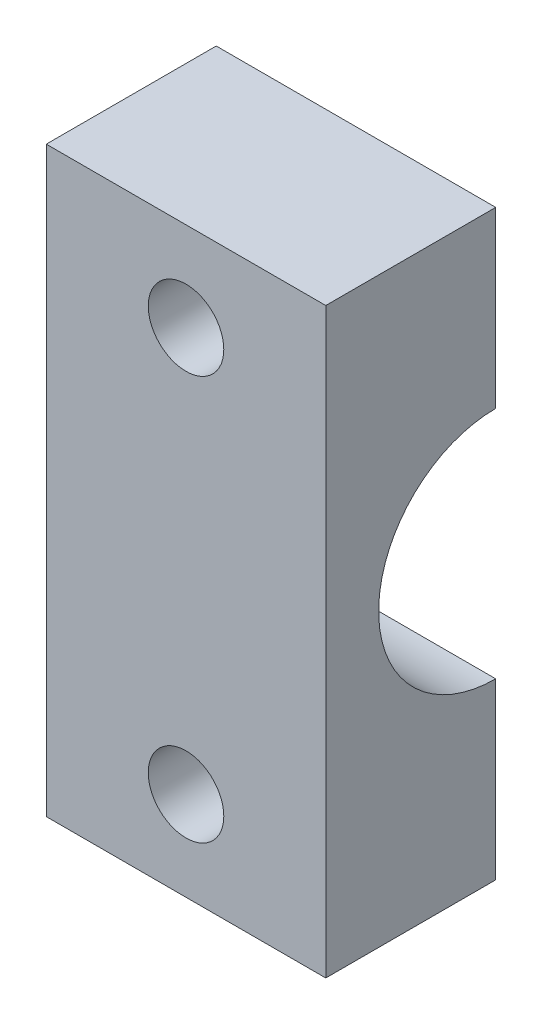
ISO-10303-21;
HEADER;
FILE_DESCRIPTION(('STEP AP214'),'2;1');
FILE_NAME('part.step','',(''),(''),'','','');
FILE_SCHEMA(('AUTOMOTIVE_DESIGN { 1 0 10303 214 1 1 1 1 }'));
ENDSEC;
DATA;
#1=APPLICATION_CONTEXT('core data for automotive mechanical design processes');
#2=APPLICATION_PROTOCOL_DEFINITION('international standard','automotive_design',2000,#1);
#3=PRODUCT_CONTEXT('',#1,'mechanical');
#4=PRODUCT('Part','Part','',(#3));
#5=PRODUCT_RELATED_PRODUCT_CATEGORY('part','',(#4));
#6=PRODUCT_DEFINITION_FORMATION('','',#4);
#7=PRODUCT_DEFINITION_CONTEXT('part definition',#1,'design');
#8=PRODUCT_DEFINITION('design','',#6,#7);
#9=PRODUCT_DEFINITION_SHAPE('','',#8);
#10=(LENGTH_UNIT() NAMED_UNIT(*) SI_UNIT(.MILLI.,.METRE.));
#11=(NAMED_UNIT(*) PLANE_ANGLE_UNIT() SI_UNIT($,.RADIAN.));
#12=(NAMED_UNIT(*) SI_UNIT($,.STERADIAN.) SOLID_ANGLE_UNIT());
#13=UNCERTAINTY_MEASURE_WITH_UNIT(LENGTH_MEASURE(1.E-05),#10,'distance_accuracy_value','');
#14=(GEOMETRIC_REPRESENTATION_CONTEXT(3) GLOBAL_UNCERTAINTY_ASSIGNED_CONTEXT((#13)) GLOBAL_UNIT_ASSIGNED_CONTEXT((#10,
#11,#12)) REPRESENTATION_CONTEXT('',''));
#15=CARTESIAN_POINT('',(0.,0.,0.));
#16=DIRECTION('',(0.,0.,1.));
#17=DIRECTION('',(1.,0.,0.));
#18=AXIS2_PLACEMENT_3D('',#15,#16,#17);
#19=CARTESIAN_POINT('',(14.8,0.,0.));
#20=DIRECTION('',(-1.,0.,0.));
#21=DIRECTION('',(0.,0.,1.));
#22=AXIS2_PLACEMENT_3D('',#19,#20,#21);
#23=PLANE('',#22);
#24=DIRECTION('',(0.,1.,0.));
#25=VECTOR('',#24,1.);
#26=CARTESIAN_POINT('',(14.8,-33.3,74.579));
#27=LINE('',#26,#25);
#28=CARTESIAN_POINT('',(14.8,-33.3,74.579));
#29=VERTEX_POINT('',#28);
#30=CARTESIAN_POINT('',(14.8,-24.08,74.579));
#31=VERTEX_POINT('',#30);
#32=EDGE_CURVE('E129',#29,#31,#27,.T.);
#33=ORIENTED_EDGE('',*,*,#32,.T.);
#34=DIRECTION('',(0.,0.,1.));
#35=VECTOR('',#34,1.);
#36=CARTESIAN_POINT('',(14.8,-24.08,74.579));
#37=LINE('',#36,#35);
#38=CARTESIAN_POINT('',(14.8,-24.08,83.579));
#39=VERTEX_POINT('',#38);
#40=EDGE_CURVE('E50',#31,#39,#37,.T.);
#41=ORIENTED_EDGE('',*,*,#40,.T.);
#42=DIRECTION('',(0.,-1.,0.));
#43=VECTOR('',#42,1.);
#44=CARTESIAN_POINT('',(14.8,-39.5,83.579));
#45=LINE('',#44,#43);
#46=CARTESIAN_POINT('',(14.8,-54.92,83.579));
#47=VERTEX_POINT('',#46);
#48=EDGE_CURVE('E81',#39,#47,#45,.T.);
#49=ORIENTED_EDGE('',*,*,#48,.T.);
#50=DIRECTION('',(0.,0.,-1.));
#51=VECTOR('',#50,1.);
#52=CARTESIAN_POINT('',(14.8,-54.92,83.579));
#53=LINE('',#52,#51);
#54=CARTESIAN_POINT('',(14.8,-54.92,74.579));
#55=VERTEX_POINT('',#54);
#56=EDGE_CURVE('E120',#47,#55,#53,.T.);
#57=ORIENTED_EDGE('',*,*,#56,.T.);
#58=DIRECTION('',(0.,1.,0.));
#59=VECTOR('',#58,1.);
#60=CARTESIAN_POINT('',(14.8,-54.92,74.579));
#61=LINE('',#60,#59);
#62=CARTESIAN_POINT('',(14.8,-45.7,74.579));
#63=VERTEX_POINT('',#62);
#64=EDGE_CURVE('E122',#55,#63,#61,.T.);
#65=ORIENTED_EDGE('',*,*,#64,.T.);
#66=CARTESIAN_POINT('',(14.8,-39.5,74.579));
#67=DIRECTION('',(-1.,0.,0.));
#68=DIRECTION('',(0.,0.,1.));
#69=AXIS2_PLACEMENT_3D('',#66,#67,#68);
#70=CIRCLE('',#69,6.2);
#71=EDGE_CURVE('E126',#63,#29,#70,.T.);
#72=ORIENTED_EDGE('',*,*,#71,.T.);
#73=EDGE_LOOP('',(#33,#41,#49,#57,#65,#72));
#74=FACE_BOUND('',#73,.T.);
#75=ADVANCED_FACE('F36',(#74),#23,.F.);
#76=CARTESIAN_POINT('',(0.,0.,0.));
#77=DIRECTION('',(-1.,0.,0.));
#78=DIRECTION('',(0.,0.,1.));
#79=AXIS2_PLACEMENT_3D('',#76,#77,#78);
#80=PLANE('',#79);
#81=DIRECTION('',(0.,0.,1.));
#82=VECTOR('',#81,1.);
#83=CARTESIAN_POINT('',(0.,-24.08,74.579));
#84=LINE('',#83,#82);
#85=CARTESIAN_POINT('',(0.,-24.08,74.579));
#86=VERTEX_POINT('',#85);
#87=CARTESIAN_POINT('',(0.,-24.08,83.579));
#88=VERTEX_POINT('',#87);
#89=EDGE_CURVE('E98',#86,#88,#84,.T.);
#90=ORIENTED_EDGE('',*,*,#89,.F.);
#91=DIRECTION('',(0.,1.,0.));
#92=VECTOR('',#91,1.);
#93=CARTESIAN_POINT('',(0.,-33.3,74.579));
#94=LINE('',#93,#92);
#95=CARTESIAN_POINT('',(0.,-33.3,74.579));
#96=VERTEX_POINT('',#95);
#97=EDGE_CURVE('E106',#96,#86,#94,.T.);
#98=ORIENTED_EDGE('',*,*,#97,.F.);
#99=CARTESIAN_POINT('',(0.,-39.5,74.579));
#100=DIRECTION('',(-1.,0.,0.));
#101=DIRECTION('',(0.,0.,1.));
#102=AXIS2_PLACEMENT_3D('',#99,#100,#101);
#103=CIRCLE('',#102,6.2);
#104=CARTESIAN_POINT('',(0.,-45.7,74.579));
#105=VERTEX_POINT('',#104);
#106=EDGE_CURVE('E113',#105,#96,#103,.T.);
#107=ORIENTED_EDGE('',*,*,#106,.F.);
#108=DIRECTION('',(0.,1.,0.));
#109=VECTOR('',#108,1.);
#110=CARTESIAN_POINT('',(0.,-54.92,74.579));
#111=LINE('',#110,#109);
#112=CARTESIAN_POINT('',(0.,-54.92,74.579));
#113=VERTEX_POINT('',#112);
#114=EDGE_CURVE('E116',#113,#105,#111,.T.);
#115=ORIENTED_EDGE('',*,*,#114,.F.);
#116=DIRECTION('',(0.,0.,-1.));
#117=VECTOR('',#116,1.);
#118=CARTESIAN_POINT('',(0.,-54.92,83.579));
#119=LINE('',#118,#117);
#120=CARTESIAN_POINT('',(0.,-54.92,83.579));
#121=VERTEX_POINT('',#120);
#122=EDGE_CURVE('E132',#121,#113,#119,.T.);
#123=ORIENTED_EDGE('',*,*,#122,.F.);
#124=DIRECTION('',(0.,-1.,0.));
#125=VECTOR('',#124,1.);
#126=CARTESIAN_POINT('',(0.,-4.5,83.579));
#127=LINE('',#126,#125);
#128=EDGE_CURVE('E59',#88,#121,#127,.T.);
#129=ORIENTED_EDGE('',*,*,#128,.F.);
#130=EDGE_LOOP('',(#90,#98,#107,#115,#123,#129));
#131=FACE_BOUND('',#130,.T.);
#132=ADVANCED_FACE('F38',(#131),#80,.T.);
#133=CARTESIAN_POINT('',(0.,-54.92,83.579));
#134=DIRECTION('',(0.,-1.,0.));
#135=DIRECTION('',(0.,0.,-1.));
#136=AXIS2_PLACEMENT_3D('',#133,#134,#135);
#137=PLANE('',#136);
#138=ORIENTED_EDGE('',*,*,#56,.F.);
#139=DIRECTION('',(1.,0.,0.));
#140=VECTOR('',#139,1.);
#141=CARTESIAN_POINT('',(0.,-54.92,83.579));
#142=LINE('',#141,#140);
#143=EDGE_CURVE('E44',#121,#47,#142,.T.);
#144=ORIENTED_EDGE('',*,*,#143,.F.);
#145=ORIENTED_EDGE('',*,*,#122,.T.);
#146=DIRECTION('',(1.,0.,0.));
#147=VECTOR('',#146,1.);
#148=CARTESIAN_POINT('',(0.,-54.92,74.579));
#149=LINE('',#148,#147);
#150=EDGE_CURVE('E87',#113,#55,#149,.T.);
#151=ORIENTED_EDGE('',*,*,#150,.T.);
#152=EDGE_LOOP('',(#138,#144,#145,#151));
#153=FACE_BOUND('',#152,.T.);
#154=ADVANCED_FACE('F158',(#153),#137,.T.);
#155=CARTESIAN_POINT('',(0.,-39.5,83.579));
#156=DIRECTION('',(0.,0.,1.));
#157=DIRECTION('',(1.,0.,0.));
#158=AXIS2_PLACEMENT_3D('',#155,#156,#157);
#159=PLANE('',#158);
#160=DIRECTION('',(1.,0.,0.));
#161=VECTOR('',#160,1.);
#162=CARTESIAN_POINT('',(0.,-24.08,83.579));
#163=LINE('',#162,#161);
#164=EDGE_CURVE('E141',#88,#39,#163,.T.);
#165=ORIENTED_EDGE('',*,*,#164,.F.);
#166=ORIENTED_EDGE('',*,*,#128,.T.);
#167=ORIENTED_EDGE('',*,*,#143,.T.);
#168=ORIENTED_EDGE('',*,*,#48,.F.);
#169=EDGE_LOOP('',(#165,#166,#167,#168));
#170=FACE_BOUND('',#169,.T.);
#171=CARTESIAN_POINT('',(7.4,-28.8,83.579));
#172=DIRECTION('',(0.,0.,1.));
#173=DIRECTION('',(1.,0.,0.));
#174=AXIS2_PLACEMENT_3D('',#171,#172,#173);
#175=CIRCLE('',#174,2.);
#176=CARTESIAN_POINT('',(9.4,-28.8,83.579));
#177=VERTEX_POINT('',#176);
#178=EDGE_CURVE('E123',#177,#177,#175,.F.);
#179=ORIENTED_EDGE('',*,*,#178,.T.);
#180=EDGE_LOOP('',(#179));
#181=FACE_BOUND('',#180,.T.);
#182=CARTESIAN_POINT('',(7.4,-50.2,83.579));
#183=DIRECTION('',(0.,0.,1.));
#184=DIRECTION('',(1.,0.,0.));
#185=AXIS2_PLACEMENT_3D('',#182,#183,#184);
#186=CIRCLE('',#185,2.);
#187=CARTESIAN_POINT('',(9.4,-50.2,83.579));
#188=VERTEX_POINT('',#187);
#189=EDGE_CURVE('E140',#188,#188,#186,.F.);
#190=ORIENTED_EDGE('',*,*,#189,.T.);
#191=EDGE_LOOP('',(#190));
#192=FACE_BOUND('',#191,.T.);
#193=ADVANCED_FACE('F159',(#170,#181,#192),#159,.T.);
#194=CARTESIAN_POINT('',(0.,-33.3,74.579));
#195=DIRECTION('',(0.,0.,-1.));
#196=DIRECTION('',(-1.,0.,0.));
#197=AXIS2_PLACEMENT_3D('',#194,#195,#196);
#198=PLANE('',#197);
#199=DIRECTION('',(-1.,0.,0.));
#200=VECTOR('',#199,1.);
#201=CARTESIAN_POINT('',(0.,-24.08,74.579));
#202=LINE('',#201,#200);
#203=EDGE_CURVE('E11',#31,#86,#202,.T.);
#204=ORIENTED_EDGE('',*,*,#203,.F.);
#205=ORIENTED_EDGE('',*,*,#32,.F.);
#206=DIRECTION('',(1.,0.,0.));
#207=VECTOR('',#206,1.);
#208=CARTESIAN_POINT('',(0.,-33.3,74.579));
#209=LINE('',#208,#207);
#210=EDGE_CURVE('E112',#96,#29,#209,.T.);
#211=ORIENTED_EDGE('',*,*,#210,.F.);
#212=ORIENTED_EDGE('',*,*,#97,.T.);
#213=EDGE_LOOP('',(#204,#205,#211,#212));
#214=FACE_BOUND('',#213,.T.);
#215=CARTESIAN_POINT('',(7.4,-28.8,74.579));
#216=DIRECTION('',(0.,0.,-1.));
#217=DIRECTION('',(-1.,0.,0.));
#218=AXIS2_PLACEMENT_3D('',#215,#216,#217);
#219=CIRCLE('',#218,2.);
#220=CARTESIAN_POINT('',(5.4,-28.8,74.579));
#221=VERTEX_POINT('',#220);
#222=EDGE_CURVE('E142',#221,#221,#219,.F.);
#223=ORIENTED_EDGE('',*,*,#222,.T.);
#224=EDGE_LOOP('',(#223));
#225=FACE_BOUND('',#224,.T.);
#226=ADVANCED_FACE('F110',(#214,#225),#198,.T.);
#227=CARTESIAN_POINT('',(0.,-39.5,74.579));
#228=DIRECTION('',(1.,0.,0.));
#229=DIRECTION('',(0.,0.,-1.));
#230=AXIS2_PLACEMENT_3D('',#227,#228,#229);
#231=CYLINDRICAL_SURFACE('',#230,6.2);
#232=ORIENTED_EDGE('',*,*,#71,.F.);
#233=DIRECTION('',(1.,0.,0.));
#234=VECTOR('',#233,1.);
#235=CARTESIAN_POINT('',(0.,-45.7,74.579));
#236=LINE('',#235,#234);
#237=EDGE_CURVE('E135',#105,#63,#236,.T.);
#238=ORIENTED_EDGE('',*,*,#237,.F.);
#239=ORIENTED_EDGE('',*,*,#106,.T.);
#240=ORIENTED_EDGE('',*,*,#210,.T.);
#241=EDGE_LOOP('',(#232,#238,#239,#240));
#242=FACE_BOUND('',#241,.T.);
#243=ADVANCED_FACE('F163',(#242),#231,.F.);
#244=CARTESIAN_POINT('',(0.,-54.92,74.579));
#245=DIRECTION('',(0.,0.,-1.));
#246=DIRECTION('',(-1.,0.,0.));
#247=AXIS2_PLACEMENT_3D('',#244,#245,#246);
#248=PLANE('',#247);
#249=CARTESIAN_POINT('',(7.4,-50.2,74.579));
#250=DIRECTION('',(0.,0.,-1.));
#251=DIRECTION('',(-1.,0.,0.));
#252=AXIS2_PLACEMENT_3D('',#249,#250,#251);
#253=CIRCLE('',#252,2.);
#254=CARTESIAN_POINT('',(5.4,-50.2,74.579));
#255=VERTEX_POINT('',#254);
#256=EDGE_CURVE('E138',#255,#255,#253,.F.);
#257=ORIENTED_EDGE('',*,*,#256,.T.);
#258=EDGE_LOOP('',(#257));
#259=FACE_BOUND('',#258,.T.);
#260=ORIENTED_EDGE('',*,*,#64,.F.);
#261=ORIENTED_EDGE('',*,*,#150,.F.);
#262=ORIENTED_EDGE('',*,*,#114,.T.);
#263=ORIENTED_EDGE('',*,*,#237,.T.);
#264=EDGE_LOOP('',(#260,#261,#262,#263));
#265=FACE_BOUND('',#264,.T.);
#266=ADVANCED_FACE('F154',(#259,#265),#248,.T.);
#267=CARTESIAN_POINT('',(7.4,-50.2,-90.));
#268=DIRECTION('',(0.,0.,1.));
#269=DIRECTION('',(1.,0.,0.));
#270=AXIS2_PLACEMENT_3D('',#267,#268,#269);
#271=CYLINDRICAL_SURFACE('',#270,2.);
#272=ORIENTED_EDGE('',*,*,#189,.F.);
#273=EDGE_LOOP('',(#272));
#274=FACE_BOUND('',#273,.T.);
#275=ORIENTED_EDGE('',*,*,#256,.F.);
#276=EDGE_LOOP('',(#275));
#277=FACE_BOUND('',#276,.T.);
#278=ADVANCED_FACE('F170',(#274,#277),#271,.F.);
#279=CARTESIAN_POINT('',(7.4,-28.8,-90.));
#280=DIRECTION('',(0.,0.,1.));
#281=DIRECTION('',(1.,0.,0.));
#282=AXIS2_PLACEMENT_3D('',#279,#280,#281);
#283=CYLINDRICAL_SURFACE('',#282,2.);
#284=ORIENTED_EDGE('',*,*,#178,.F.);
#285=EDGE_LOOP('',(#284));
#286=FACE_BOUND('',#285,.T.);
#287=ORIENTED_EDGE('',*,*,#222,.F.);
#288=EDGE_LOOP('',(#287));
#289=FACE_BOUND('',#288,.T.);
#290=ADVANCED_FACE('F192',(#286,#289),#283,.F.);
#291=CARTESIAN_POINT('',(14.8,-24.08,74.579));
#292=DIRECTION('',(0.,-1.,0.));
#293=DIRECTION('',(0.,0.,-1.));
#294=AXIS2_PLACEMENT_3D('',#291,#292,#293);
#295=PLANE('',#294);
#296=ORIENTED_EDGE('',*,*,#164,.T.);
#297=ORIENTED_EDGE('',*,*,#40,.F.);
#298=ORIENTED_EDGE('',*,*,#203,.T.);
#299=ORIENTED_EDGE('',*,*,#89,.T.);
#300=EDGE_LOOP('',(#296,#297,#298,#299));
#301=FACE_BOUND('',#300,.T.);
#302=ADVANCED_FACE('F97',(#301),#295,.F.);
#303=CLOSED_SHELL('',(#75,#132,#154,#193,#226,#243,#266,#278,#290,#302));
#304=MANIFOLD_SOLID_BREP('B2',#303);
#305=ADVANCED_BREP_SHAPE_REPRESENTATION('',(#18,#304),#14);
#306=SHAPE_DEFINITION_REPRESENTATION(#9,#305);
ENDSEC;
END-ISO-10303-21;
